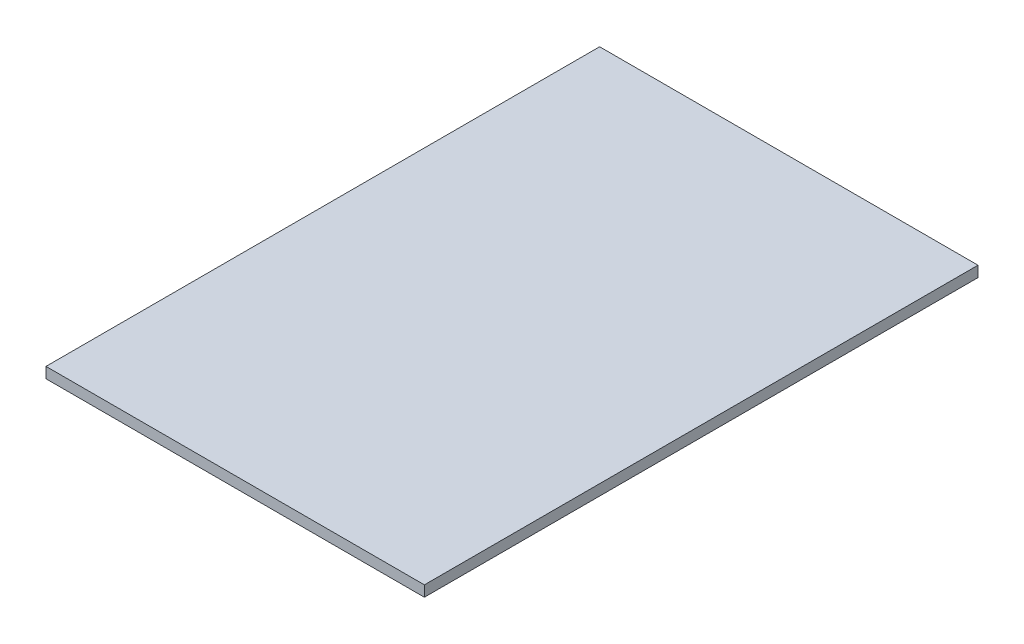
ISO-10303-21;
HEADER;
FILE_DESCRIPTION(('STEP AP214'),'2;1');
FILE_NAME('part.step','',(''),(''),'','','');
FILE_SCHEMA(('AUTOMOTIVE_DESIGN { 1 0 10303 214 1 1 1 1 }'));
ENDSEC;
DATA;
#1=APPLICATION_CONTEXT('core data for automotive mechanical design processes');
#2=APPLICATION_PROTOCOL_DEFINITION('international standard','automotive_design',2000,#1);
#3=PRODUCT_CONTEXT('',#1,'mechanical');
#4=PRODUCT('Part','Part','',(#3));
#5=PRODUCT_RELATED_PRODUCT_CATEGORY('part','',(#4));
#6=PRODUCT_DEFINITION_FORMATION('','',#4);
#7=PRODUCT_DEFINITION_CONTEXT('part definition',#1,'design');
#8=PRODUCT_DEFINITION('design','',#6,#7);
#9=PRODUCT_DEFINITION_SHAPE('','',#8);
#10=(LENGTH_UNIT() NAMED_UNIT(*) SI_UNIT(.MILLI.,.METRE.));
#11=(NAMED_UNIT(*) PLANE_ANGLE_UNIT() SI_UNIT($,.RADIAN.));
#12=(NAMED_UNIT(*) SI_UNIT($,.STERADIAN.) SOLID_ANGLE_UNIT());
#13=UNCERTAINTY_MEASURE_WITH_UNIT(LENGTH_MEASURE(1.E-05),#10,'distance_accuracy_value','');
#14=(GEOMETRIC_REPRESENTATION_CONTEXT(3) GLOBAL_UNCERTAINTY_ASSIGNED_CONTEXT((#13)) GLOBAL_UNIT_ASSIGNED_CONTEXT((#10,
#11,#12)) REPRESENTATION_CONTEXT('',''));
#15=CARTESIAN_POINT('',(0.,0.,0.));
#16=DIRECTION('',(0.,0.,1.));
#17=DIRECTION('',(1.,0.,0.));
#18=AXIS2_PLACEMENT_3D('',#15,#16,#17);
#19=CARTESIAN_POINT('',(3.110415140968,22.,2.573615632082));
#20=DIRECTION('',(0.,0.,-1.));
#21=DIRECTION('',(-1.,0.,0.));
#22=AXIS2_PLACEMENT_3D('',#19,#20,#21);
#23=PLANE('',#22);
#24=DIRECTION('',(1.,0.,0.));
#25=VECTOR('',#24,1.);
#26=CARTESIAN_POINT('',(3.110415140968,21.9,2.573615632082));
#27=LINE('',#26,#25);
#28=CARTESIAN_POINT('',(3.110415140968,21.9,2.573615632082));
#29=VERTEX_POINT('',#28);
#30=CARTESIAN_POINT('',(6.628363968557,21.9,2.573615632082));
#31=VERTEX_POINT('',#30);
#32=EDGE_CURVE('E11',#29,#31,#27,.T.);
#33=ORIENTED_EDGE('',*,*,#32,.T.);
#34=DIRECTION('',(0.,-1.,0.));
#35=VECTOR('',#34,1.);
#36=CARTESIAN_POINT('',(6.628363968557,22.,2.573615632082));
#37=LINE('',#36,#35);
#38=CARTESIAN_POINT('',(6.628363968557,22.,2.573615632082));
#39=VERTEX_POINT('',#38);
#40=EDGE_CURVE('E24',#39,#31,#37,.T.);
#41=ORIENTED_EDGE('',*,*,#40,.F.);
#42=DIRECTION('',(1.,0.,0.));
#43=VECTOR('',#42,1.);
#44=CARTESIAN_POINT('',(3.110415140968,22.,2.573615632082));
#45=LINE('',#44,#43);
#46=CARTESIAN_POINT('',(3.110415140968,22.,2.573615632082));
#47=VERTEX_POINT('',#46);
#48=EDGE_CURVE('E88',#47,#39,#45,.T.);
#49=ORIENTED_EDGE('',*,*,#48,.F.);
#50=DIRECTION('',(0.,-1.,0.));
#51=VECTOR('',#50,1.);
#52=CARTESIAN_POINT('',(3.110415140968,22.,2.573615632082));
#53=LINE('',#52,#51);
#54=EDGE_CURVE('E77',#47,#29,#53,.T.);
#55=ORIENTED_EDGE('',*,*,#54,.T.);
#56=EDGE_LOOP('',(#33,#41,#49,#55));
#57=FACE_BOUND('',#56,.T.);
#58=ADVANCED_FACE('F17',(#57),#23,.F.);
#59=CARTESIAN_POINT('',(6.628363968557,22.,2.573615632082));
#60=DIRECTION('',(-1.,0.,0.));
#61=DIRECTION('',(0.,0.,1.));
#62=AXIS2_PLACEMENT_3D('',#59,#60,#61);
#63=PLANE('',#62);
#64=DIRECTION('',(0.,0.,-1.));
#65=VECTOR('',#64,1.);
#66=CARTESIAN_POINT('',(6.628363968557,21.9,2.573615632082));
#67=LINE('',#66,#65);
#68=CARTESIAN_POINT('',(6.628363968557,21.9,-2.573615632082));
#69=VERTEX_POINT('',#68);
#70=EDGE_CURVE('E85',#31,#69,#67,.T.);
#71=ORIENTED_EDGE('',*,*,#70,.T.);
#72=DIRECTION('',(0.,-1.,0.));
#73=VECTOR('',#72,1.);
#74=CARTESIAN_POINT('',(6.628363968557,22.,-2.573615632082));
#75=LINE('',#74,#73);
#76=CARTESIAN_POINT('',(6.628363968557,22.,-2.573615632082));
#77=VERTEX_POINT('',#76);
#78=EDGE_CURVE('E83',#77,#69,#75,.T.);
#79=ORIENTED_EDGE('',*,*,#78,.F.);
#80=DIRECTION('',(0.,0.,-1.));
#81=VECTOR('',#80,1.);
#82=CARTESIAN_POINT('',(6.628363968557,22.,2.573615632082));
#83=LINE('',#82,#81);
#84=EDGE_CURVE('E72',#39,#77,#83,.T.);
#85=ORIENTED_EDGE('',*,*,#84,.F.);
#86=ORIENTED_EDGE('',*,*,#40,.T.);
#87=EDGE_LOOP('',(#71,#79,#85,#86));
#88=FACE_BOUND('',#87,.T.);
#89=ADVANCED_FACE('F90',(#88),#63,.F.);
#90=CARTESIAN_POINT('',(6.628363968557,22.,-2.573615632082));
#91=DIRECTION('',(0.,0.,1.));
#92=DIRECTION('',(1.,0.,0.));
#93=AXIS2_PLACEMENT_3D('',#90,#91,#92);
#94=PLANE('',#93);
#95=DIRECTION('',(-1.,0.,0.));
#96=VECTOR('',#95,1.);
#97=CARTESIAN_POINT('',(6.628363968557,21.9,-2.573615632082));
#98=LINE('',#97,#96);
#99=CARTESIAN_POINT('',(3.110415140968,21.9,-2.573615632082));
#100=VERTEX_POINT('',#99);
#101=EDGE_CURVE('E60',#69,#100,#98,.T.);
#102=ORIENTED_EDGE('',*,*,#101,.T.);
#103=DIRECTION('',(0.,-1.,0.));
#104=VECTOR('',#103,1.);
#105=CARTESIAN_POINT('',(3.110415140968,22.,-2.573615632082));
#106=LINE('',#105,#104);
#107=CARTESIAN_POINT('',(3.110415140968,22.,-2.573615632082));
#108=VERTEX_POINT('',#107);
#109=EDGE_CURVE('E54',#108,#100,#106,.T.);
#110=ORIENTED_EDGE('',*,*,#109,.F.);
#111=DIRECTION('',(-1.,0.,0.));
#112=VECTOR('',#111,1.);
#113=CARTESIAN_POINT('',(6.628363968557,22.,-2.573615632082));
#114=LINE('',#113,#112);
#115=EDGE_CURVE('E58',#77,#108,#114,.T.);
#116=ORIENTED_EDGE('',*,*,#115,.F.);
#117=ORIENTED_EDGE('',*,*,#78,.T.);
#118=EDGE_LOOP('',(#102,#110,#116,#117));
#119=FACE_BOUND('',#118,.T.);
#120=ADVANCED_FACE('F56',(#119),#94,.F.);
#121=CARTESIAN_POINT('',(3.110415140968,22.,-2.573615632082));
#122=DIRECTION('',(1.,0.,0.));
#123=DIRECTION('',(0.,0.,-1.));
#124=AXIS2_PLACEMENT_3D('',#121,#122,#123);
#125=PLANE('',#124);
#126=DIRECTION('',(0.,0.,1.));
#127=VECTOR('',#126,1.);
#128=CARTESIAN_POINT('',(3.110415140968,21.9,-2.573615632082));
#129=LINE('',#128,#127);
#130=EDGE_CURVE('E73',#100,#29,#129,.T.);
#131=ORIENTED_EDGE('',*,*,#130,.T.);
#132=ORIENTED_EDGE('',*,*,#54,.F.);
#133=DIRECTION('',(0.,0.,1.));
#134=VECTOR('',#133,1.);
#135=CARTESIAN_POINT('',(3.110415140968,22.,-2.573615632082));
#136=LINE('',#135,#134);
#137=EDGE_CURVE('E70',#108,#47,#136,.T.);
#138=ORIENTED_EDGE('',*,*,#137,.F.);
#139=ORIENTED_EDGE('',*,*,#109,.T.);
#140=EDGE_LOOP('',(#131,#132,#138,#139));
#141=FACE_BOUND('',#140,.T.);
#142=ADVANCED_FACE('F76',(#141),#125,.F.);
#143=CARTESIAN_POINT('',(0.,22.,0.));
#144=DIRECTION('',(0.,1.,0.));
#145=DIRECTION('',(0.,0.,1.));
#146=AXIS2_PLACEMENT_3D('',#143,#144,#145);
#147=PLANE('',#146);
#148=ORIENTED_EDGE('',*,*,#48,.T.);
#149=ORIENTED_EDGE('',*,*,#84,.T.);
#150=ORIENTED_EDGE('',*,*,#115,.T.);
#151=ORIENTED_EDGE('',*,*,#137,.T.);
#152=EDGE_LOOP('',(#148,#149,#150,#151));
#153=FACE_BOUND('',#152,.T.);
#154=ADVANCED_FACE('F69',(#153),#147,.T.);
#155=CARTESIAN_POINT('',(0.,21.9,0.));
#156=DIRECTION('',(0.,1.,0.));
#157=DIRECTION('',(0.,0.,1.));
#158=AXIS2_PLACEMENT_3D('',#155,#156,#157);
#159=PLANE('',#158);
#160=ORIENTED_EDGE('',*,*,#32,.F.);
#161=ORIENTED_EDGE('',*,*,#130,.F.);
#162=ORIENTED_EDGE('',*,*,#101,.F.);
#163=ORIENTED_EDGE('',*,*,#70,.F.);
#164=EDGE_LOOP('',(#160,#161,#162,#163));
#165=FACE_BOUND('',#164,.T.);
#166=ADVANCED_FACE('F91',(#165),#159,.F.);
#167=CLOSED_SHELL('',(#58,#89,#120,#142,#154,#166));
#168=MANIFOLD_SOLID_BREP('B1',#167);
#169=ADVANCED_BREP_SHAPE_REPRESENTATION('',(#18,#168),#14);
#170=SHAPE_DEFINITION_REPRESENTATION(#9,#169);
ENDSEC;
END-ISO-10303-21;
